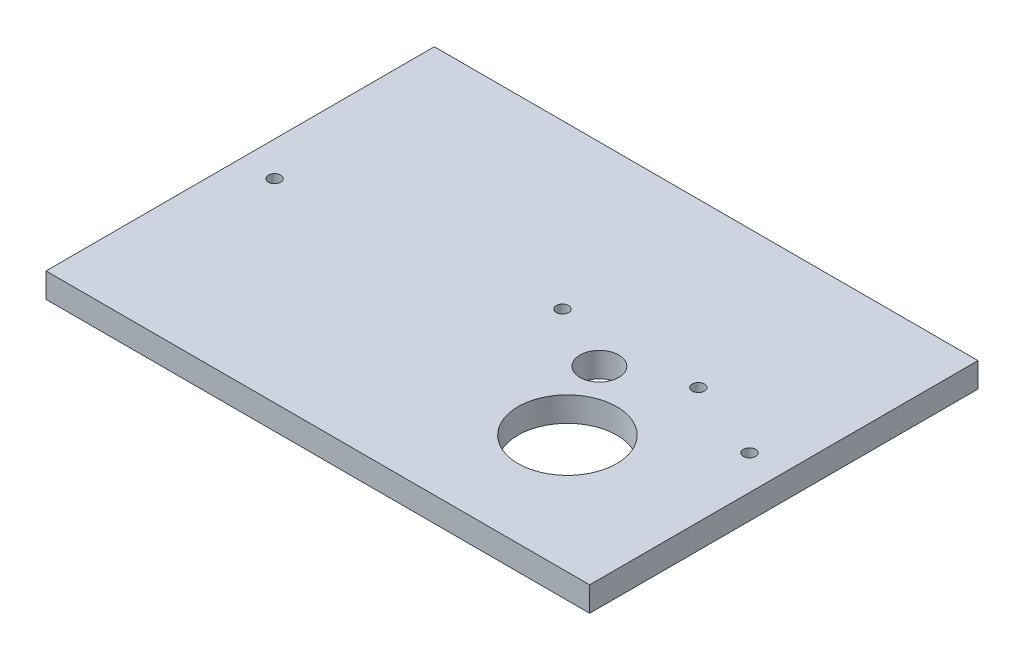
ISO-10303-21;
HEADER;
FILE_DESCRIPTION(('STEP AP214'),'2;1');
FILE_NAME('part.step','',(''),(''),'','','');
FILE_SCHEMA(('AUTOMOTIVE_DESIGN { 1 0 10303 214 1 1 1 1 }'));
ENDSEC;
DATA;
#1=APPLICATION_CONTEXT('core data for automotive mechanical design processes');
#2=APPLICATION_PROTOCOL_DEFINITION('international standard','automotive_design',2000,#1);
#3=PRODUCT_CONTEXT('',#1,'mechanical');
#4=PRODUCT('Part','Part','',(#3));
#5=PRODUCT_RELATED_PRODUCT_CATEGORY('part','',(#4));
#6=PRODUCT_DEFINITION_FORMATION('','',#4);
#7=PRODUCT_DEFINITION_CONTEXT('part definition',#1,'design');
#8=PRODUCT_DEFINITION('design','',#6,#7);
#9=PRODUCT_DEFINITION_SHAPE('','',#8);
#10=(LENGTH_UNIT() NAMED_UNIT(*) SI_UNIT(.MILLI.,.METRE.));
#11=(NAMED_UNIT(*) PLANE_ANGLE_UNIT() SI_UNIT($,.RADIAN.));
#12=(NAMED_UNIT(*) SI_UNIT($,.STERADIAN.) SOLID_ANGLE_UNIT());
#13=UNCERTAINTY_MEASURE_WITH_UNIT(LENGTH_MEASURE(1.E-05),#10,'distance_accuracy_value','');
#14=(GEOMETRIC_REPRESENTATION_CONTEXT(3) GLOBAL_UNCERTAINTY_ASSIGNED_CONTEXT((#13)) GLOBAL_UNIT_ASSIGNED_CONTEXT((#10,
#11,#12)) REPRESENTATION_CONTEXT('',''));
#15=CARTESIAN_POINT('',(0.,0.,0.));
#16=DIRECTION('',(0.,0.,1.));
#17=DIRECTION('',(1.,0.,0.));
#18=AXIS2_PLACEMENT_3D('',#15,#16,#17);
#19=CARTESIAN_POINT('',(0.,6.35,0.));
#20=DIRECTION('',(1.,0.,0.));
#21=DIRECTION('',(0.,0.,-1.));
#22=AXIS2_PLACEMENT_3D('',#19,#20,#21);
#23=PLANE('',#22);
#24=DIRECTION('',(0.,0.,1.));
#25=VECTOR('',#24,1.);
#26=CARTESIAN_POINT('',(0.,0.,0.));
#27=LINE('',#26,#25);
#28=CARTESIAN_POINT('',(0.,0.,-100.));
#29=VERTEX_POINT('',#28);
#30=CARTESIAN_POINT('',(0.,0.,0.));
#31=VERTEX_POINT('',#30);
#32=EDGE_CURVE('E98',#29,#31,#27,.T.);
#33=ORIENTED_EDGE('',*,*,#32,.T.);
#34=DIRECTION('',(0.,-1.,0.));
#35=VECTOR('',#34,1.);
#36=CARTESIAN_POINT('',(0.,6.35,0.));
#37=LINE('',#36,#35);
#38=CARTESIAN_POINT('',(0.,6.35,0.));
#39=VERTEX_POINT('',#38);
#40=EDGE_CURVE('E11',#39,#31,#37,.T.);
#41=ORIENTED_EDGE('',*,*,#40,.F.);
#42=DIRECTION('',(0.,0.,1.));
#43=VECTOR('',#42,1.);
#44=CARTESIAN_POINT('',(0.,6.35,0.));
#45=LINE('',#44,#43);
#46=CARTESIAN_POINT('',(0.,6.35,-100.));
#47=VERTEX_POINT('',#46);
#48=EDGE_CURVE('E85',#47,#39,#45,.T.);
#49=ORIENTED_EDGE('',*,*,#48,.F.);
#50=DIRECTION('',(0.,-1.,0.));
#51=VECTOR('',#50,1.);
#52=CARTESIAN_POINT('',(0.,6.35,-100.));
#53=LINE('',#52,#51);
#54=EDGE_CURVE('E94',#47,#29,#53,.T.);
#55=ORIENTED_EDGE('',*,*,#54,.T.);
#56=EDGE_LOOP('',(#33,#41,#49,#55));
#57=FACE_BOUND('',#56,.T.);
#58=ADVANCED_FACE('F32',(#57),#23,.F.);
#59=CARTESIAN_POINT('',(0.,6.35,0.));
#60=DIRECTION('',(0.,0.,-1.));
#61=DIRECTION('',(-1.,0.,0.));
#62=AXIS2_PLACEMENT_3D('',#59,#60,#61);
#63=PLANE('',#62);
#64=DIRECTION('',(1.,0.,0.));
#65=VECTOR('',#64,1.);
#66=CARTESIAN_POINT('',(0.,0.,0.));
#67=LINE('',#66,#65);
#68=CARTESIAN_POINT('',(140.,0.,0.));
#69=VERTEX_POINT('',#68);
#70=EDGE_CURVE('E89',#31,#69,#67,.T.);
#71=ORIENTED_EDGE('',*,*,#70,.T.);
#72=DIRECTION('',(0.,-1.,0.));
#73=VECTOR('',#72,1.);
#74=CARTESIAN_POINT('',(140.,6.35,0.));
#75=LINE('',#74,#73);
#76=CARTESIAN_POINT('',(140.,6.35,0.));
#77=VERTEX_POINT('',#76);
#78=EDGE_CURVE('E41',#77,#69,#75,.T.);
#79=ORIENTED_EDGE('',*,*,#78,.F.);
#80=DIRECTION('',(1.,0.,0.));
#81=VECTOR('',#80,1.);
#82=CARTESIAN_POINT('',(0.,6.35,0.));
#83=LINE('',#82,#81);
#84=EDGE_CURVE('E80',#39,#77,#83,.T.);
#85=ORIENTED_EDGE('',*,*,#84,.F.);
#86=ORIENTED_EDGE('',*,*,#40,.T.);
#87=EDGE_LOOP('',(#71,#79,#85,#86));
#88=FACE_BOUND('',#87,.T.);
#89=ADVANCED_FACE('F88',(#88),#63,.F.);
#90=CARTESIAN_POINT('',(140.,6.35,0.));
#91=DIRECTION('',(-1.,0.,0.));
#92=DIRECTION('',(0.,0.,1.));
#93=AXIS2_PLACEMENT_3D('',#90,#91,#92);
#94=PLANE('',#93);
#95=DIRECTION('',(0.,0.,-1.));
#96=VECTOR('',#95,1.);
#97=CARTESIAN_POINT('',(140.,0.,0.));
#98=LINE('',#97,#96);
#99=CARTESIAN_POINT('',(140.,0.,-100.));
#100=VERTEX_POINT('',#99);
#101=EDGE_CURVE('E67',#69,#100,#98,.T.);
#102=ORIENTED_EDGE('',*,*,#101,.T.);
#103=DIRECTION('',(0.,-1.,0.));
#104=VECTOR('',#103,1.);
#105=CARTESIAN_POINT('',(140.,6.35,-100.));
#106=LINE('',#105,#104);
#107=CARTESIAN_POINT('',(140.,6.35,-100.));
#108=VERTEX_POINT('',#107);
#109=EDGE_CURVE('E90',#108,#100,#106,.T.);
#110=ORIENTED_EDGE('',*,*,#109,.F.);
#111=DIRECTION('',(0.,0.,-1.));
#112=VECTOR('',#111,1.);
#113=CARTESIAN_POINT('',(140.,6.35,0.));
#114=LINE('',#113,#112);
#115=EDGE_CURVE('E83',#77,#108,#114,.T.);
#116=ORIENTED_EDGE('',*,*,#115,.F.);
#117=ORIENTED_EDGE('',*,*,#78,.T.);
#118=EDGE_LOOP('',(#102,#110,#116,#117));
#119=FACE_BOUND('',#118,.T.);
#120=ADVANCED_FACE('F92',(#119),#94,.F.);
#121=CARTESIAN_POINT('',(0.,6.35,-100.));
#122=DIRECTION('',(0.,0.,1.));
#123=DIRECTION('',(1.,0.,0.));
#124=AXIS2_PLACEMENT_3D('',#121,#122,#123);
#125=PLANE('',#124);
#126=DIRECTION('',(-1.,0.,0.));
#127=VECTOR('',#126,1.);
#128=CARTESIAN_POINT('',(0.,0.,-100.));
#129=LINE('',#128,#127);
#130=EDGE_CURVE('E73',#100,#29,#129,.T.);
#131=ORIENTED_EDGE('',*,*,#130,.T.);
#132=ORIENTED_EDGE('',*,*,#54,.F.);
#133=DIRECTION('',(-1.,0.,0.));
#134=VECTOR('',#133,1.);
#135=CARTESIAN_POINT('',(0.,6.35,-100.));
#136=LINE('',#135,#134);
#137=EDGE_CURVE('E50',#108,#47,#136,.T.);
#138=ORIENTED_EDGE('',*,*,#137,.F.);
#139=ORIENTED_EDGE('',*,*,#109,.T.);
#140=EDGE_LOOP('',(#131,#132,#138,#139));
#141=FACE_BOUND('',#140,.T.);
#142=ADVANCED_FACE('F151',(#141),#125,.F.);
#143=CARTESIAN_POINT('',(0.,6.35,0.));
#144=DIRECTION('',(0.,-1.,0.));
#145=DIRECTION('',(0.,0.,-1.));
#146=AXIS2_PLACEMENT_3D('',#143,#144,#145);
#147=PLANE('',#146);
#148=CARTESIAN_POINT('',(8.85,6.35,-50.));
#149=DIRECTION('',(0.,1.,0.));
#150=DIRECTION('',(0.,0.,1.));
#151=AXIS2_PLACEMENT_3D('',#148,#149,#150);
#152=CIRCLE('',#151,1.5875);
#153=CARTESIAN_POINT('',(8.85,6.35,-48.4125));
#154=VERTEX_POINT('',#153);
#155=EDGE_CURVE('E117',#154,#154,#152,.T.);
#156=ORIENTED_EDGE('',*,*,#155,.F.);
#157=EDGE_LOOP('',(#156));
#158=FACE_BOUND('',#157,.T.);
#159=CARTESIAN_POINT('',(110.,6.35,-58.));
#160=DIRECTION('',(0.,1.,0.));
#161=DIRECTION('',(0.,0.,1.));
#162=AXIS2_PLACEMENT_3D('',#159,#160,#161);
#163=CIRCLE('',#162,1.5875);
#164=CARTESIAN_POINT('',(110.,6.35,-56.4125));
#165=VERTEX_POINT('',#164);
#166=EDGE_CURVE('E138',#165,#165,#163,.T.);
#167=ORIENTED_EDGE('',*,*,#166,.F.);
#168=EDGE_LOOP('',(#167));
#169=FACE_BOUND('',#168,.T.);
#170=CARTESIAN_POINT('',(75.,6.35,-58.));
#171=DIRECTION('',(0.,1.,0.));
#172=DIRECTION('',(0.,0.,1.));
#173=AXIS2_PLACEMENT_3D('',#170,#171,#172);
#174=CIRCLE('',#173,1.5875);
#175=CARTESIAN_POINT('',(75.,6.35,-56.4125));
#176=VERTEX_POINT('',#175);
#177=EDGE_CURVE('E134',#176,#176,#174,.T.);
#178=ORIENTED_EDGE('',*,*,#177,.F.);
#179=EDGE_LOOP('',(#178));
#180=FACE_BOUND('',#179,.T.);
#181=CARTESIAN_POINT('',(131.15,6.35,-50.));
#182=DIRECTION('',(0.,1.,0.));
#183=DIRECTION('',(0.,0.,1.));
#184=AXIS2_PLACEMENT_3D('',#181,#182,#183);
#185=CIRCLE('',#184,1.58749999999999);
#186=CARTESIAN_POINT('',(131.15,6.35,-48.4125));
#187=VERTEX_POINT('',#186);
#188=EDGE_CURVE('E137',#187,#187,#185,.T.);
#189=ORIENTED_EDGE('',*,*,#188,.F.);
#190=EDGE_LOOP('',(#189));
#191=FACE_BOUND('',#190,.T.);
#192=CARTESIAN_POINT('',(103.75,6.35,-30.5144284148501));
#193=DIRECTION('',(0.,1.,0.));
#194=DIRECTION('',(0.,0.,1.));
#195=AXIS2_PLACEMENT_3D('',#192,#193,#194);
#196=CIRCLE('',#195,12.705);
#197=CARTESIAN_POINT('',(103.75,6.35,-17.8094284148501));
#198=VERTEX_POINT('',#197);
#199=EDGE_CURVE('E110',#198,#198,#196,.T.);
#200=ORIENTED_EDGE('',*,*,#199,.F.);
#201=EDGE_LOOP('',(#200));
#202=FACE_BOUND('',#201,.T.);
#203=CARTESIAN_POINT('',(92.5,6.35,-50.));
#204=DIRECTION('',(0.,1.,0.));
#205=DIRECTION('',(0.,0.,1.));
#206=AXIS2_PLACEMENT_3D('',#203,#204,#205);
#207=CIRCLE('',#206,5.00000000000001);
#208=CARTESIAN_POINT('',(92.5,6.35,-45.));
#209=VERTEX_POINT('',#208);
#210=EDGE_CURVE('E124',#209,#209,#207,.T.);
#211=ORIENTED_EDGE('',*,*,#210,.F.);
#212=EDGE_LOOP('',(#211));
#213=FACE_BOUND('',#212,.T.);
#214=ORIENTED_EDGE('',*,*,#48,.T.);
#215=ORIENTED_EDGE('',*,*,#84,.T.);
#216=ORIENTED_EDGE('',*,*,#115,.T.);
#217=ORIENTED_EDGE('',*,*,#137,.T.);
#218=EDGE_LOOP('',(#214,#215,#216,#217));
#219=FACE_BOUND('',#218,.T.);
#220=ADVANCED_FACE('F81',(#158,#169,#180,#191,#202,#213,#219),#147,.F.);
#221=CARTESIAN_POINT('',(0.,0.,0.));
#222=DIRECTION('',(0.,-1.,0.));
#223=DIRECTION('',(0.,0.,-1.));
#224=AXIS2_PLACEMENT_3D('',#221,#222,#223);
#225=PLANE('',#224);
#226=CARTESIAN_POINT('',(8.85,0.,-50.));
#227=DIRECTION('',(0.,-1.,0.));
#228=DIRECTION('',(0.,0.,-1.));
#229=AXIS2_PLACEMENT_3D('',#226,#227,#228);
#230=CIRCLE('',#229,1.5875);
#231=CARTESIAN_POINT('',(8.85,0.,-51.5875));
#232=VERTEX_POINT('',#231);
#233=EDGE_CURVE('E35',#232,#232,#230,.T.);
#234=ORIENTED_EDGE('',*,*,#233,.F.);
#235=EDGE_LOOP('',(#234));
#236=FACE_BOUND('',#235,.T.);
#237=CARTESIAN_POINT('',(110.,0.,-58.));
#238=DIRECTION('',(0.,-1.,0.));
#239=DIRECTION('',(0.,0.,-1.));
#240=AXIS2_PLACEMENT_3D('',#237,#238,#239);
#241=CIRCLE('',#240,1.5875);
#242=CARTESIAN_POINT('',(110.,0.,-59.5875));
#243=VERTEX_POINT('',#242);
#244=EDGE_CURVE('E119',#243,#243,#241,.T.);
#245=ORIENTED_EDGE('',*,*,#244,.F.);
#246=EDGE_LOOP('',(#245));
#247=FACE_BOUND('',#246,.T.);
#248=CARTESIAN_POINT('',(75.,0.,-58.));
#249=DIRECTION('',(0.,-1.,0.));
#250=DIRECTION('',(0.,0.,-1.));
#251=AXIS2_PLACEMENT_3D('',#248,#249,#250);
#252=CIRCLE('',#251,1.5875);
#253=CARTESIAN_POINT('',(75.,0.,-59.5875));
#254=VERTEX_POINT('',#253);
#255=EDGE_CURVE('E116',#254,#254,#252,.T.);
#256=ORIENTED_EDGE('',*,*,#255,.F.);
#257=EDGE_LOOP('',(#256));
#258=FACE_BOUND('',#257,.T.);
#259=CARTESIAN_POINT('',(131.15,0.,-50.));
#260=DIRECTION('',(0.,-1.,0.));
#261=DIRECTION('',(0.,0.,-1.));
#262=AXIS2_PLACEMENT_3D('',#259,#260,#261);
#263=CIRCLE('',#262,1.58749999999999);
#264=CARTESIAN_POINT('',(131.15,0.,-51.5875));
#265=VERTEX_POINT('',#264);
#266=EDGE_CURVE('E113',#265,#265,#263,.T.);
#267=ORIENTED_EDGE('',*,*,#266,.F.);
#268=EDGE_LOOP('',(#267));
#269=FACE_BOUND('',#268,.T.);
#270=CARTESIAN_POINT('',(103.75,0.,-30.5144284148501));
#271=DIRECTION('',(0.,-1.,0.));
#272=DIRECTION('',(0.,0.,-1.));
#273=AXIS2_PLACEMENT_3D('',#270,#271,#272);
#274=CIRCLE('',#273,12.705);
#275=CARTESIAN_POINT('',(103.75,0.,-43.2194284148501));
#276=VERTEX_POINT('',#275);
#277=EDGE_CURVE('E101',#276,#276,#274,.T.);
#278=ORIENTED_EDGE('',*,*,#277,.F.);
#279=EDGE_LOOP('',(#278));
#280=FACE_BOUND('',#279,.T.);
#281=CARTESIAN_POINT('',(92.5,0.,-50.));
#282=DIRECTION('',(0.,-1.,0.));
#283=DIRECTION('',(0.,0.,-1.));
#284=AXIS2_PLACEMENT_3D('',#281,#282,#283);
#285=CIRCLE('',#284,5.00000000000001);
#286=CARTESIAN_POINT('',(92.5,0.,-55.));
#287=VERTEX_POINT('',#286);
#288=EDGE_CURVE('E107',#287,#287,#285,.T.);
#289=ORIENTED_EDGE('',*,*,#288,.F.);
#290=EDGE_LOOP('',(#289));
#291=FACE_BOUND('',#290,.T.);
#292=ORIENTED_EDGE('',*,*,#32,.F.);
#293=ORIENTED_EDGE('',*,*,#130,.F.);
#294=ORIENTED_EDGE('',*,*,#101,.F.);
#295=ORIENTED_EDGE('',*,*,#70,.F.);
#296=EDGE_LOOP('',(#292,#293,#294,#295));
#297=FACE_BOUND('',#296,.T.);
#298=ADVANCED_FACE('F150',(#236,#247,#258,#269,#280,#291,#297),#225,.T.);
#299=CARTESIAN_POINT('',(92.5,-3.65,-50.));
#300=DIRECTION('',(0.,1.,0.));
#301=DIRECTION('',(0.,0.,1.));
#302=AXIS2_PLACEMENT_3D('',#299,#300,#301);
#303=CYLINDRICAL_SURFACE('',#302,5.00000000000001);
#304=ORIENTED_EDGE('',*,*,#288,.T.);
#305=EDGE_LOOP('',(#304));
#306=FACE_BOUND('',#305,.T.);
#307=ORIENTED_EDGE('',*,*,#210,.T.);
#308=EDGE_LOOP('',(#307));
#309=FACE_BOUND('',#308,.T.);
#310=ADVANCED_FACE('F165',(#306,#309),#303,.F.);
#311=CARTESIAN_POINT('',(103.75,-3.65,-30.5144284148501));
#312=DIRECTION('',(0.,1.,0.));
#313=DIRECTION('',(0.,0.,1.));
#314=AXIS2_PLACEMENT_3D('',#311,#312,#313);
#315=CYLINDRICAL_SURFACE('',#314,12.705);
#316=ORIENTED_EDGE('',*,*,#277,.T.);
#317=EDGE_LOOP('',(#316));
#318=FACE_BOUND('',#317,.T.);
#319=ORIENTED_EDGE('',*,*,#199,.T.);
#320=EDGE_LOOP('',(#319));
#321=FACE_BOUND('',#320,.T.);
#322=ADVANCED_FACE('F162',(#318,#321),#315,.F.);
#323=CARTESIAN_POINT('',(131.15,-3.65,-50.));
#324=DIRECTION('',(0.,1.,0.));
#325=DIRECTION('',(0.,0.,1.));
#326=AXIS2_PLACEMENT_3D('',#323,#324,#325);
#327=CYLINDRICAL_SURFACE('',#326,1.58749999999999);
#328=ORIENTED_EDGE('',*,*,#266,.T.);
#329=EDGE_LOOP('',(#328));
#330=FACE_BOUND('',#329,.T.);
#331=ORIENTED_EDGE('',*,*,#188,.T.);
#332=EDGE_LOOP('',(#331));
#333=FACE_BOUND('',#332,.T.);
#334=ADVANCED_FACE('F164',(#330,#333),#327,.F.);
#335=CARTESIAN_POINT('',(75.,-3.65,-58.));
#336=DIRECTION('',(0.,1.,0.));
#337=DIRECTION('',(0.,0.,1.));
#338=AXIS2_PLACEMENT_3D('',#335,#336,#337);
#339=CYLINDRICAL_SURFACE('',#338,1.5875);
#340=ORIENTED_EDGE('',*,*,#255,.T.);
#341=EDGE_LOOP('',(#340));
#342=FACE_BOUND('',#341,.T.);
#343=ORIENTED_EDGE('',*,*,#177,.T.);
#344=EDGE_LOOP('',(#343));
#345=FACE_BOUND('',#344,.T.);
#346=ADVANCED_FACE('F172',(#342,#345),#339,.F.);
#347=CARTESIAN_POINT('',(110.,-3.65,-58.));
#348=DIRECTION('',(0.,1.,0.));
#349=DIRECTION('',(0.,0.,1.));
#350=AXIS2_PLACEMENT_3D('',#347,#348,#349);
#351=CYLINDRICAL_SURFACE('',#350,1.5875);
#352=ORIENTED_EDGE('',*,*,#244,.T.);
#353=EDGE_LOOP('',(#352));
#354=FACE_BOUND('',#353,.T.);
#355=ORIENTED_EDGE('',*,*,#166,.T.);
#356=EDGE_LOOP('',(#355));
#357=FACE_BOUND('',#356,.T.);
#358=ADVANCED_FACE('F236',(#354,#357),#351,.F.);
#359=CARTESIAN_POINT('',(8.85,-3.65,-50.));
#360=DIRECTION('',(0.,1.,0.));
#361=DIRECTION('',(0.,0.,1.));
#362=AXIS2_PLACEMENT_3D('',#359,#360,#361);
#363=CYLINDRICAL_SURFACE('',#362,1.5875);
#364=ORIENTED_EDGE('',*,*,#233,.T.);
#365=EDGE_LOOP('',(#364));
#366=FACE_BOUND('',#365,.T.);
#367=ORIENTED_EDGE('',*,*,#155,.T.);
#368=EDGE_LOOP('',(#367));
#369=FACE_BOUND('',#368,.T.);
#370=ADVANCED_FACE('F146',(#366,#369),#363,.F.);
#371=CLOSED_SHELL('',(#58,#89,#120,#142,#220,#298,#310,#322,#334,#346,#358,#370));
#372=MANIFOLD_SOLID_BREP('B2',#371);
#373=ADVANCED_BREP_SHAPE_REPRESENTATION('',(#18,#372),#14);
#374=SHAPE_DEFINITION_REPRESENTATION(#9,#373);
ENDSEC;
END-ISO-10303-21;
